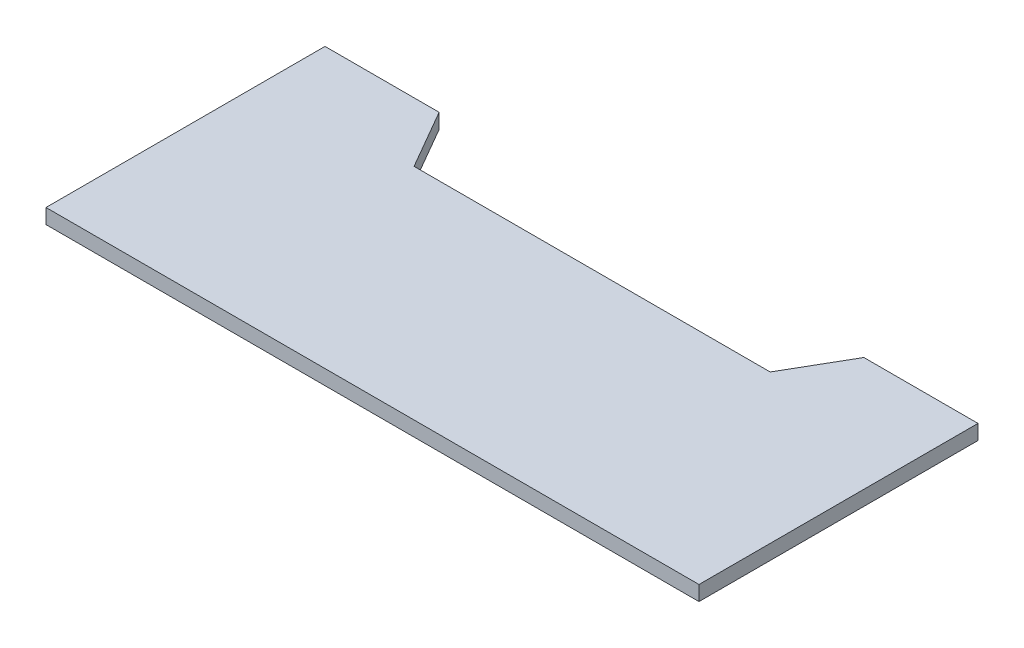
ISO-10303-21;
HEADER;
FILE_DESCRIPTION(('STEP AP214'),'2;1');
FILE_NAME('part.step','',(''),(''),'','','');
FILE_SCHEMA(('AUTOMOTIVE_DESIGN { 1 0 10303 214 1 1 1 1 }'));
ENDSEC;
DATA;
#1=APPLICATION_CONTEXT('core data for automotive mechanical design processes');
#2=APPLICATION_PROTOCOL_DEFINITION('international standard','automotive_design',2000,#1);
#3=PRODUCT_CONTEXT('',#1,'mechanical');
#4=PRODUCT('Part','Part','',(#3));
#5=PRODUCT_RELATED_PRODUCT_CATEGORY('part','',(#4));
#6=PRODUCT_DEFINITION_FORMATION('','',#4);
#7=PRODUCT_DEFINITION_CONTEXT('part definition',#1,'design');
#8=PRODUCT_DEFINITION('design','',#6,#7);
#9=PRODUCT_DEFINITION_SHAPE('','',#8);
#10=(LENGTH_UNIT() NAMED_UNIT(*) SI_UNIT(.MILLI.,.METRE.));
#11=(NAMED_UNIT(*) PLANE_ANGLE_UNIT() SI_UNIT($,.RADIAN.));
#12=(NAMED_UNIT(*) SI_UNIT($,.STERADIAN.) SOLID_ANGLE_UNIT());
#13=UNCERTAINTY_MEASURE_WITH_UNIT(LENGTH_MEASURE(1.E-05),#10,'distance_accuracy_value','');
#14=(GEOMETRIC_REPRESENTATION_CONTEXT(3) GLOBAL_UNCERTAINTY_ASSIGNED_CONTEXT((#13)) GLOBAL_UNIT_ASSIGNED_CONTEXT((#10,
#11,#12)) REPRESENTATION_CONTEXT('',''));
#15=CARTESIAN_POINT('',(0.,0.,0.));
#16=DIRECTION('',(0.,0.,1.));
#17=DIRECTION('',(1.,0.,0.));
#18=AXIS2_PLACEMENT_3D('',#15,#16,#17);
#19=CARTESIAN_POINT('',(0.,6.35,-119.38));
#20=DIRECTION('',(0.,0.,1.));
#21=DIRECTION('',(1.,0.,0.));
#22=AXIS2_PLACEMENT_3D('',#19,#20,#21);
#23=PLANE('',#22);
#24=DIRECTION('',(-1.,0.,0.));
#25=VECTOR('',#24,1.);
#26=CARTESIAN_POINT('',(0.,0.,-119.38));
#27=LINE('',#26,#25);
#28=CARTESIAN_POINT('',(279.4,0.,-119.38));
#29=VERTEX_POINT('',#28);
#30=CARTESIAN_POINT('',(230.564696837416,0.,-119.38));
#31=VERTEX_POINT('',#30);
#32=EDGE_CURVE('E133',#29,#31,#27,.T.);
#33=ORIENTED_EDGE('',*,*,#32,.T.);
#34=DIRECTION('',(0.,1.,0.));
#35=VECTOR('',#34,1.);
#36=CARTESIAN_POINT('',(230.564696837416,0.,-119.38));
#37=LINE('',#36,#35);
#38=CARTESIAN_POINT('',(230.564696837416,6.35,-119.38));
#39=VERTEX_POINT('',#38);
#40=EDGE_CURVE('E164',#31,#39,#37,.T.);
#41=ORIENTED_EDGE('',*,*,#40,.T.);
#42=DIRECTION('',(-1.,0.,0.));
#43=VECTOR('',#42,1.);
#44=CARTESIAN_POINT('',(0.,6.35,-119.38));
#45=LINE('',#44,#43);
#46=CARTESIAN_POINT('',(279.4,6.35,-119.38));
#47=VERTEX_POINT('',#46);
#48=EDGE_CURVE('E148',#47,#39,#45,.T.);
#49=ORIENTED_EDGE('',*,*,#48,.F.);
#50=DIRECTION('',(0.,-1.,0.));
#51=VECTOR('',#50,1.);
#52=CARTESIAN_POINT('',(279.4,6.35,-119.38));
#53=LINE('',#52,#51);
#54=EDGE_CURVE('E147',#47,#29,#53,.T.);
#55=ORIENTED_EDGE('',*,*,#54,.T.);
#56=EDGE_LOOP('',(#33,#41,#49,#55));
#57=FACE_BOUND('',#56,.T.);
#58=ADVANCED_FACE('F39',(#57),#23,.F.);
#59=CARTESIAN_POINT('',(0.,6.35,0.));
#60=DIRECTION('',(1.,0.,0.));
#61=DIRECTION('',(0.,0.,-1.));
#62=AXIS2_PLACEMENT_3D('',#59,#60,#61);
#63=PLANE('',#62);
#64=DIRECTION('',(0.,0.,1.));
#65=VECTOR('',#64,1.);
#66=CARTESIAN_POINT('',(0.,0.,0.));
#67=LINE('',#66,#65);
#68=CARTESIAN_POINT('',(0.,0.,-119.38));
#69=VERTEX_POINT('',#68);
#70=CARTESIAN_POINT('',(0.,0.,0.));
#71=VERTEX_POINT('',#70);
#72=EDGE_CURVE('E131',#69,#71,#67,.T.);
#73=ORIENTED_EDGE('',*,*,#72,.T.);
#74=DIRECTION('',(0.,-1.,0.));
#75=VECTOR('',#74,1.);
#76=CARTESIAN_POINT('',(0.,6.35,0.));
#77=LINE('',#76,#75);
#78=CARTESIAN_POINT('',(0.,6.35,0.));
#79=VERTEX_POINT('',#78);
#80=EDGE_CURVE('E11',#79,#71,#77,.T.);
#81=ORIENTED_EDGE('',*,*,#80,.F.);
#82=DIRECTION('',(0.,0.,1.));
#83=VECTOR('',#82,1.);
#84=CARTESIAN_POINT('',(0.,6.35,0.));
#85=LINE('',#84,#83);
#86=CARTESIAN_POINT('',(0.,6.35,-119.38));
#87=VERTEX_POINT('',#86);
#88=EDGE_CURVE('E139',#87,#79,#85,.T.);
#89=ORIENTED_EDGE('',*,*,#88,.F.);
#90=DIRECTION('',(0.,-1.,0.));
#91=VECTOR('',#90,1.);
#92=CARTESIAN_POINT('',(0.,6.35,-119.38));
#93=LINE('',#92,#91);
#94=EDGE_CURVE('E144',#87,#69,#93,.T.);
#95=ORIENTED_EDGE('',*,*,#94,.T.);
#96=EDGE_LOOP('',(#73,#81,#89,#95));
#97=FACE_BOUND('',#96,.T.);
#98=ADVANCED_FACE('F41',(#97),#63,.F.);
#99=CARTESIAN_POINT('',(0.,6.35,0.));
#100=DIRECTION('',(0.,0.,-1.));
#101=DIRECTION('',(-1.,0.,0.));
#102=AXIS2_PLACEMENT_3D('',#99,#100,#101);
#103=PLANE('',#102);
#104=DIRECTION('',(1.,0.,0.));
#105=VECTOR('',#104,1.);
#106=CARTESIAN_POINT('',(0.,0.,0.));
#107=LINE('',#106,#105);
#108=CARTESIAN_POINT('',(279.4,0.,0.));
#109=VERTEX_POINT('',#108);
#110=EDGE_CURVE('E140',#71,#109,#107,.T.);
#111=ORIENTED_EDGE('',*,*,#110,.T.);
#112=DIRECTION('',(0.,-1.,0.));
#113=VECTOR('',#112,1.);
#114=CARTESIAN_POINT('',(279.4,6.35,0.));
#115=LINE('',#114,#113);
#116=CARTESIAN_POINT('',(279.4,6.35,0.));
#117=VERTEX_POINT('',#116);
#118=EDGE_CURVE('E48',#117,#109,#115,.T.);
#119=ORIENTED_EDGE('',*,*,#118,.F.);
#120=DIRECTION('',(1.,0.,0.));
#121=VECTOR('',#120,1.);
#122=CARTESIAN_POINT('',(0.,6.35,0.));
#123=LINE('',#122,#121);
#124=EDGE_CURVE('E93',#79,#117,#123,.T.);
#125=ORIENTED_EDGE('',*,*,#124,.F.);
#126=ORIENTED_EDGE('',*,*,#80,.T.);
#127=EDGE_LOOP('',(#111,#119,#125,#126));
#128=FACE_BOUND('',#127,.T.);
#129=ADVANCED_FACE('F175',(#128),#103,.F.);
#130=CARTESIAN_POINT('',(279.4,6.35,0.));
#131=DIRECTION('',(-1.,0.,0.));
#132=DIRECTION('',(0.,0.,1.));
#133=AXIS2_PLACEMENT_3D('',#130,#131,#132);
#134=PLANE('',#133);
#135=DIRECTION('',(0.,0.,-1.));
#136=VECTOR('',#135,1.);
#137=CARTESIAN_POINT('',(279.4,0.,0.));
#138=LINE('',#137,#136);
#139=EDGE_CURVE('E134',#109,#29,#138,.T.);
#140=ORIENTED_EDGE('',*,*,#139,.T.);
#141=ORIENTED_EDGE('',*,*,#54,.F.);
#142=DIRECTION('',(0.,0.,-1.));
#143=VECTOR('',#142,1.);
#144=CARTESIAN_POINT('',(279.4,6.35,0.));
#145=LINE('',#144,#143);
#146=EDGE_CURVE('E158',#117,#47,#145,.T.);
#147=ORIENTED_EDGE('',*,*,#146,.F.);
#148=ORIENTED_EDGE('',*,*,#118,.T.);
#149=EDGE_LOOP('',(#140,#141,#147,#148));
#150=FACE_BOUND('',#149,.T.);
#151=ADVANCED_FACE('F156',(#150),#134,.F.);
#152=CARTESIAN_POINT('',(48.8353031625836,6.35,-119.38));
#153=VERTEX_POINT('',#152);
#154=EDGE_CURVE('E64',#153,#87,#45,.T.);
#155=ORIENTED_EDGE('',*,*,#154,.F.);
#156=DIRECTION('',(0.,1.,0.));
#157=VECTOR('',#156,1.);
#158=CARTESIAN_POINT('',(48.8353031625836,0.,-119.38));
#159=LINE('',#158,#157);
#160=CARTESIAN_POINT('',(48.8353031625836,0.,-119.38));
#161=VERTEX_POINT('',#160);
#162=EDGE_CURVE('E117',#161,#153,#159,.T.);
#163=ORIENTED_EDGE('',*,*,#162,.F.);
#164=EDGE_CURVE('E86',#161,#69,#27,.T.);
#165=ORIENTED_EDGE('',*,*,#164,.T.);
#166=ORIENTED_EDGE('',*,*,#94,.F.);
#167=EDGE_LOOP('',(#155,#163,#165,#166));
#168=FACE_BOUND('',#167,.T.);
#169=ADVANCED_FACE('F123',(#168),#23,.F.);
#170=CARTESIAN_POINT('',(0.,6.35,0.));
#171=DIRECTION('',(0.,-1.,0.));
#172=DIRECTION('',(0.,0.,-1.));
#173=AXIS2_PLACEMENT_3D('',#170,#171,#172);
#174=PLANE('',#173);
#175=ORIENTED_EDGE('',*,*,#48,.T.);
#176=DIRECTION('',(0.499999999999999,0.,-0.866025403784439));
#177=VECTOR('',#176,1.);
#178=CARTESIAN_POINT('',(215.9,6.35,-93.98));
#179=LINE('',#178,#177);
#180=CARTESIAN_POINT('',(215.9,6.35,-93.98));
#181=VERTEX_POINT('',#180);
#182=EDGE_CURVE('E121',#181,#39,#179,.T.);
#183=ORIENTED_EDGE('',*,*,#182,.F.);
#184=DIRECTION('',(1.,0.,0.));
#185=VECTOR('',#184,1.);
#186=CARTESIAN_POINT('',(63.5,6.35,-93.98));
#187=LINE('',#186,#185);
#188=CARTESIAN_POINT('',(63.5,6.35,-93.98));
#189=VERTEX_POINT('',#188);
#190=EDGE_CURVE('E192',#189,#181,#187,.T.);
#191=ORIENTED_EDGE('',*,*,#190,.F.);
#192=DIRECTION('',(0.499999999999998,0.,0.86602540378444));
#193=VECTOR('',#192,1.);
#194=CARTESIAN_POINT('',(48.8353031625836,6.35,-119.38));
#195=LINE('',#194,#193);
#196=EDGE_CURVE('E196',#153,#189,#195,.T.);
#197=ORIENTED_EDGE('',*,*,#196,.F.);
#198=ORIENTED_EDGE('',*,*,#154,.T.);
#199=ORIENTED_EDGE('',*,*,#88,.T.);
#200=ORIENTED_EDGE('',*,*,#124,.T.);
#201=ORIENTED_EDGE('',*,*,#146,.T.);
#202=EDGE_LOOP('',(#175,#183,#191,#197,#198,#199,#200,#201));
#203=FACE_BOUND('',#202,.T.);
#204=ADVANCED_FACE('F203',(#203),#174,.F.);
#205=CARTESIAN_POINT('',(0.,0.,0.));
#206=DIRECTION('',(0.,-1.,0.));
#207=DIRECTION('',(0.,0.,-1.));
#208=AXIS2_PLACEMENT_3D('',#205,#206,#207);
#209=PLANE('',#208);
#210=DIRECTION('',(0.499999999999999,0.,-0.866025403784439));
#211=VECTOR('',#210,1.);
#212=CARTESIAN_POINT('',(215.9,0.,-93.98));
#213=LINE('',#212,#211);
#214=CARTESIAN_POINT('',(215.9,0.,-93.98));
#215=VERTEX_POINT('',#214);
#216=EDGE_CURVE('E125',#215,#31,#213,.T.);
#217=ORIENTED_EDGE('',*,*,#216,.T.);
#218=ORIENTED_EDGE('',*,*,#32,.F.);
#219=ORIENTED_EDGE('',*,*,#139,.F.);
#220=ORIENTED_EDGE('',*,*,#110,.F.);
#221=ORIENTED_EDGE('',*,*,#72,.F.);
#222=ORIENTED_EDGE('',*,*,#164,.F.);
#223=DIRECTION('',(0.499999999999998,0.,0.86602540378444));
#224=VECTOR('',#223,1.);
#225=CARTESIAN_POINT('',(48.8353031625836,0.,-119.38));
#226=LINE('',#225,#224);
#227=CARTESIAN_POINT('',(63.5,0.,-93.98));
#228=VERTEX_POINT('',#227);
#229=EDGE_CURVE('E114',#161,#228,#226,.T.);
#230=ORIENTED_EDGE('',*,*,#229,.T.);
#231=DIRECTION('',(1.,0.,0.));
#232=VECTOR('',#231,1.);
#233=CARTESIAN_POINT('',(63.5,0.,-93.98));
#234=LINE('',#233,#232);
#235=EDGE_CURVE('E55',#228,#215,#234,.T.);
#236=ORIENTED_EDGE('',*,*,#235,.T.);
#237=EDGE_LOOP('',(#217,#218,#219,#220,#221,#222,#230,#236));
#238=FACE_BOUND('',#237,.T.);
#239=ADVANCED_FACE('F129',(#238),#209,.T.);
#240=CARTESIAN_POINT('',(215.9,0.,-93.98));
#241=DIRECTION('',(0.866025403784439,0.,0.499999999999999));
#242=DIRECTION('',(0.499999999999999,0.,-0.86602540378444));
#243=AXIS2_PLACEMENT_3D('',#240,#241,#242);
#244=PLANE('',#243);
#245=ORIENTED_EDGE('',*,*,#182,.T.);
#246=ORIENTED_EDGE('',*,*,#40,.F.);
#247=ORIENTED_EDGE('',*,*,#216,.F.);
#248=DIRECTION('',(0.,1.,0.));
#249=VECTOR('',#248,1.);
#250=CARTESIAN_POINT('',(215.9,0.,-93.98));
#251=LINE('',#250,#249);
#252=EDGE_CURVE('E185',#215,#181,#251,.T.);
#253=ORIENTED_EDGE('',*,*,#252,.T.);
#254=EDGE_LOOP('',(#245,#246,#247,#253));
#255=FACE_BOUND('',#254,.T.);
#256=ADVANCED_FACE('F206',(#255),#244,.F.);
#257=CARTESIAN_POINT('',(63.5,0.,-93.98));
#258=DIRECTION('',(0.,0.,1.));
#259=DIRECTION('',(1.,0.,0.));
#260=AXIS2_PLACEMENT_3D('',#257,#258,#259);
#261=PLANE('',#260);
#262=ORIENTED_EDGE('',*,*,#190,.T.);
#263=ORIENTED_EDGE('',*,*,#252,.F.);
#264=ORIENTED_EDGE('',*,*,#235,.F.);
#265=DIRECTION('',(0.,1.,0.));
#266=VECTOR('',#265,1.);
#267=CARTESIAN_POINT('',(63.5,0.,-93.98));
#268=LINE('',#267,#266);
#269=EDGE_CURVE('E118',#228,#189,#268,.T.);
#270=ORIENTED_EDGE('',*,*,#269,.T.);
#271=EDGE_LOOP('',(#262,#263,#264,#270));
#272=FACE_BOUND('',#271,.T.);
#273=ADVANCED_FACE('F204',(#272),#261,.F.);
#274=CARTESIAN_POINT('',(48.8353031625836,0.,-119.38));
#275=DIRECTION('',(-0.86602540378444,0.,0.499999999999998));
#276=DIRECTION('',(0.499999999999998,0.,0.86602540378444));
#277=AXIS2_PLACEMENT_3D('',#274,#275,#276);
#278=PLANE('',#277);
#279=ORIENTED_EDGE('',*,*,#196,.T.);
#280=ORIENTED_EDGE('',*,*,#269,.F.);
#281=ORIENTED_EDGE('',*,*,#229,.F.);
#282=ORIENTED_EDGE('',*,*,#162,.T.);
#283=EDGE_LOOP('',(#279,#280,#281,#282));
#284=FACE_BOUND('',#283,.T.);
#285=ADVANCED_FACE('F116',(#284),#278,.F.);
#286=CLOSED_SHELL('',(#58,#98,#129,#151,#169,#204,#239,#256,#273,#285));
#287=MANIFOLD_SOLID_BREP('B2',#286);
#288=ADVANCED_BREP_SHAPE_REPRESENTATION('',(#18,#287),#14);
#289=SHAPE_DEFINITION_REPRESENTATION(#9,#288);
ENDSEC;
END-ISO-10303-21;
